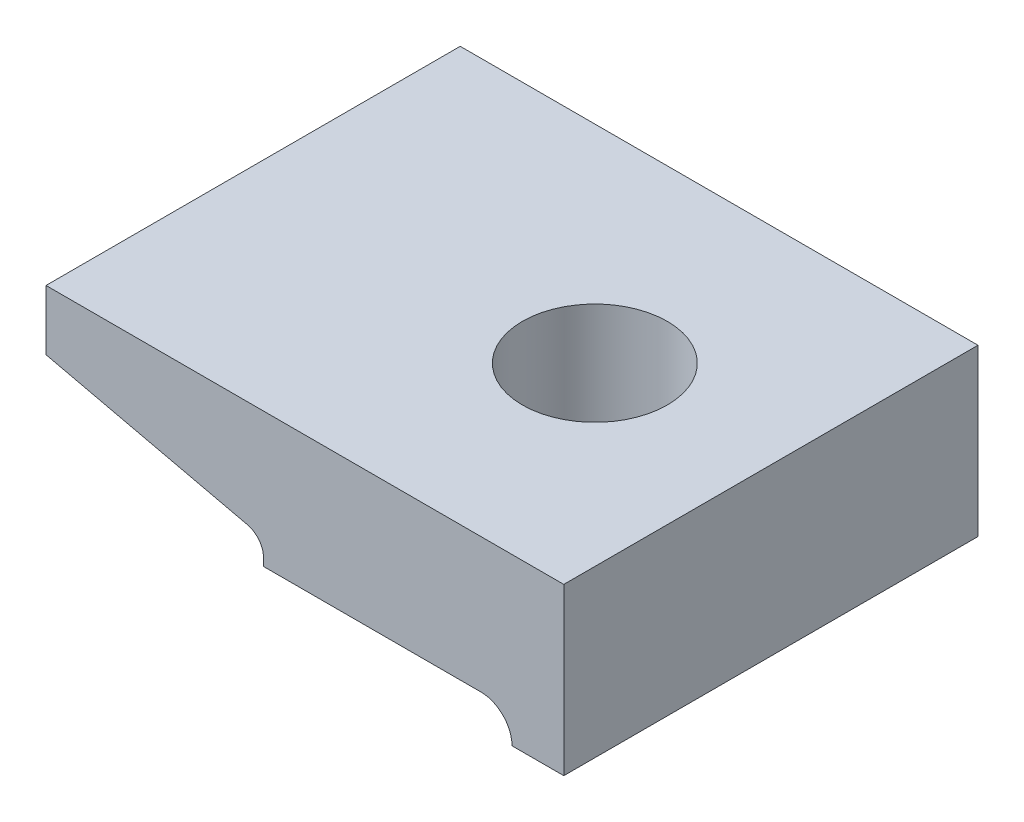
ISO-10303-21;
HEADER;
FILE_DESCRIPTION(('STEP AP214'),'2;1');
FILE_NAME('part.step','',(''),(''),'','','');
FILE_SCHEMA(('AUTOMOTIVE_DESIGN { 1 0 10303 214 1 1 1 1 }'));
ENDSEC;
DATA;
#1=APPLICATION_CONTEXT('core data for automotive mechanical design processes');
#2=APPLICATION_PROTOCOL_DEFINITION('international standard','automotive_design',2000,#1);
#3=PRODUCT_CONTEXT('',#1,'mechanical');
#4=PRODUCT('Part','Part','',(#3));
#5=PRODUCT_RELATED_PRODUCT_CATEGORY('part','',(#4));
#6=PRODUCT_DEFINITION_FORMATION('','',#4);
#7=PRODUCT_DEFINITION_CONTEXT('part definition',#1,'design');
#8=PRODUCT_DEFINITION('design','',#6,#7);
#9=PRODUCT_DEFINITION_SHAPE('','',#8);
#10=(LENGTH_UNIT() NAMED_UNIT(*) SI_UNIT(.MILLI.,.METRE.));
#11=(NAMED_UNIT(*) PLANE_ANGLE_UNIT() SI_UNIT($,.RADIAN.));
#12=(NAMED_UNIT(*) SI_UNIT($,.STERADIAN.) SOLID_ANGLE_UNIT());
#13=UNCERTAINTY_MEASURE_WITH_UNIT(LENGTH_MEASURE(1.E-05),#10,'distance_accuracy_value','');
#14=(GEOMETRIC_REPRESENTATION_CONTEXT(3) GLOBAL_UNCERTAINTY_ASSIGNED_CONTEXT((#13)) GLOBAL_UNIT_ASSIGNED_CONTEXT((#10,
#11,#12)) REPRESENTATION_CONTEXT('',''));
#15=CARTESIAN_POINT('',(0.,0.,0.));
#16=DIRECTION('',(0.,0.,1.));
#17=DIRECTION('',(1.,0.,0.));
#18=AXIS2_PLACEMENT_3D('',#15,#16,#17);
#19=CARTESIAN_POINT('',(70.,0.,20.));
#20=DIRECTION('',(0.,0.,-1.));
#21=DIRECTION('',(-1.,0.,0.));
#22=AXIS2_PLACEMENT_3D('',#19,#20,#21);
#23=CYLINDRICAL_SURFACE('',#22,3.);
#24=CARTESIAN_POINT('',(70.,0.,-20.));
#25=DIRECTION('',(0.,0.,-1.));
#26=DIRECTION('',(1.,0.,0.));
#27=AXIS2_PLACEMENT_3D('',#24,#25,#26);
#28=CIRCLE('',#27,3.);
#29=CARTESIAN_POINT('',(70.,3.,-20.));
#30=VERTEX_POINT('',#29);
#31=CARTESIAN_POINT('',(73.,0.,-20.));
#32=VERTEX_POINT('',#31);
#33=EDGE_CURVE('E140',#30,#32,#28,.T.);
#34=ORIENTED_EDGE('',*,*,#33,.T.);
#35=DIRECTION('',(0.,0.,-1.));
#36=VECTOR('',#35,1.);
#37=CARTESIAN_POINT('',(73.,0.,20.));
#38=LINE('',#37,#36);
#39=CARTESIAN_POINT('',(73.,0.,20.));
#40=VERTEX_POINT('',#39);
#41=EDGE_CURVE('E11',#40,#32,#38,.T.);
#42=ORIENTED_EDGE('',*,*,#41,.F.);
#43=CARTESIAN_POINT('',(70.,0.,20.));
#44=DIRECTION('',(0.,0.,-1.));
#45=DIRECTION('',(1.,0.,0.));
#46=AXIS2_PLACEMENT_3D('',#43,#44,#45);
#47=CIRCLE('',#46,3.);
#48=CARTESIAN_POINT('',(70.,3.,20.));
#49=VERTEX_POINT('',#48);
#50=EDGE_CURVE('E156',#49,#40,#47,.T.);
#51=ORIENTED_EDGE('',*,*,#50,.F.);
#52=DIRECTION('',(0.,0.,-1.));
#53=VECTOR('',#52,1.);
#54=CARTESIAN_POINT('',(70.,3.,20.));
#55=LINE('',#54,#53);
#56=EDGE_CURVE('E136',#49,#30,#55,.T.);
#57=ORIENTED_EDGE('',*,*,#56,.T.);
#58=EDGE_LOOP('',(#34,#42,#51,#57));
#59=FACE_BOUND('',#58,.T.);
#60=ADVANCED_FACE('F37',(#59),#23,.F.);
#61=CARTESIAN_POINT('',(73.,0.,20.));
#62=DIRECTION('',(0.,1.,0.));
#63=DIRECTION('',(0.,0.,1.));
#64=AXIS2_PLACEMENT_3D('',#61,#62,#63);
#65=PLANE('',#64);
#66=DIRECTION('',(1.,0.,0.));
#67=VECTOR('',#66,1.);
#68=CARTESIAN_POINT('',(73.,0.,-20.));
#69=LINE('',#68,#67);
#70=CARTESIAN_POINT('',(78.,0.,-20.));
#71=VERTEX_POINT('',#70);
#72=EDGE_CURVE('E143',#32,#71,#69,.T.);
#73=ORIENTED_EDGE('',*,*,#72,.T.);
#74=DIRECTION('',(0.,0.,-1.));
#75=VECTOR('',#74,1.);
#76=CARTESIAN_POINT('',(78.,0.,20.));
#77=LINE('',#76,#75);
#78=CARTESIAN_POINT('',(78.,0.,20.));
#79=VERTEX_POINT('',#78);
#80=EDGE_CURVE('E46',#79,#71,#77,.T.);
#81=ORIENTED_EDGE('',*,*,#80,.F.);
#82=DIRECTION('',(1.,0.,0.));
#83=VECTOR('',#82,1.);
#84=CARTESIAN_POINT('',(73.,0.,20.));
#85=LINE('',#84,#83);
#86=EDGE_CURVE('E100',#40,#79,#85,.T.);
#87=ORIENTED_EDGE('',*,*,#86,.F.);
#88=ORIENTED_EDGE('',*,*,#41,.T.);
#89=EDGE_LOOP('',(#73,#81,#87,#88));
#90=FACE_BOUND('',#89,.T.);
#91=ADVANCED_FACE('F216',(#90),#65,.F.);
#92=CARTESIAN_POINT('',(78.,0.,20.));
#93=DIRECTION('',(-1.,0.,0.));
#94=DIRECTION('',(0.,0.,1.));
#95=AXIS2_PLACEMENT_3D('',#92,#93,#94);
#96=PLANE('',#95);
#97=DIRECTION('',(0.,1.,0.));
#98=VECTOR('',#97,1.);
#99=CARTESIAN_POINT('',(78.,0.,-20.));
#100=LINE('',#99,#98);
#101=CARTESIAN_POINT('',(78.,16.,-20.));
#102=VERTEX_POINT('',#101);
#103=EDGE_CURVE('E145',#71,#102,#100,.T.);
#104=ORIENTED_EDGE('',*,*,#103,.T.);
#105=DIRECTION('',(0.,0.,-1.));
#106=VECTOR('',#105,1.);
#107=CARTESIAN_POINT('',(78.,16.,20.));
#108=LINE('',#107,#106);
#109=CARTESIAN_POINT('',(78.,16.,20.));
#110=VERTEX_POINT('',#109);
#111=EDGE_CURVE('E166',#110,#102,#108,.T.);
#112=ORIENTED_EDGE('',*,*,#111,.F.);
#113=DIRECTION('',(0.,1.,0.));
#114=VECTOR('',#113,1.);
#115=CARTESIAN_POINT('',(78.,0.,20.));
#116=LINE('',#115,#114);
#117=EDGE_CURVE('E175',#79,#110,#116,.T.);
#118=ORIENTED_EDGE('',*,*,#117,.F.);
#119=ORIENTED_EDGE('',*,*,#80,.T.);
#120=EDGE_LOOP('',(#104,#112,#118,#119));
#121=FACE_BOUND('',#120,.T.);
#122=ADVANCED_FACE('F173',(#121),#96,.F.);
#123=CARTESIAN_POINT('',(78.,16.,20.));
#124=DIRECTION('',(0.,-1.,0.));
#125=DIRECTION('',(1.,0.,0.));
#126=AXIS2_PLACEMENT_3D('',#123,#124,#125);
#127=PLANE('',#126);
#128=CARTESIAN_POINT('',(61.,16.,0.));
#129=DIRECTION('',(0.,1.,0.));
#130=DIRECTION('',(-1.,0.,0.));
#131=AXIS2_PLACEMENT_3D('',#128,#129,#130);
#132=CIRCLE('',#131,6.99999999999999);
#133=CARTESIAN_POINT('',(54.,16.,0.));
#134=VERTEX_POINT('',#133);
#135=EDGE_CURVE('E198',#134,#134,#132,.T.);
#136=ORIENTED_EDGE('',*,*,#135,.F.);
#137=EDGE_LOOP('',(#136));
#138=FACE_BOUND('',#137,.T.);
#139=DIRECTION('',(-1.,0.,0.));
#140=VECTOR('',#139,1.);
#141=CARTESIAN_POINT('',(78.,16.,-20.));
#142=LINE('',#141,#140);
#143=CARTESIAN_POINT('',(28.,16.,-20.));
#144=VERTEX_POINT('',#143);
#145=EDGE_CURVE('E147',#102,#144,#142,.T.);
#146=ORIENTED_EDGE('',*,*,#145,.T.);
#147=DIRECTION('',(0.,0.,-1.));
#148=VECTOR('',#147,1.);
#149=CARTESIAN_POINT('',(28.,16.,20.));
#150=LINE('',#149,#148);
#151=CARTESIAN_POINT('',(28.,16.,20.));
#152=VERTEX_POINT('',#151);
#153=EDGE_CURVE('E163',#152,#144,#150,.T.);
#154=ORIENTED_EDGE('',*,*,#153,.F.);
#155=DIRECTION('',(-1.,0.,0.));
#156=VECTOR('',#155,1.);
#157=CARTESIAN_POINT('',(78.,16.,20.));
#158=LINE('',#157,#156);
#159=EDGE_CURVE('E191',#110,#152,#158,.T.);
#160=ORIENTED_EDGE('',*,*,#159,.F.);
#161=ORIENTED_EDGE('',*,*,#111,.T.);
#162=EDGE_LOOP('',(#146,#154,#160,#161));
#163=FACE_BOUND('',#162,.T.);
#164=ADVANCED_FACE('F184',(#138,#163),#127,.F.);
#165=CARTESIAN_POINT('',(28.,16.,20.));
#166=DIRECTION('',(1.,0.,0.));
#167=DIRECTION('',(0.,0.,-1.));
#168=AXIS2_PLACEMENT_3D('',#165,#166,#167);
#169=PLANE('',#168);
#170=DIRECTION('',(0.,-1.,0.));
#171=VECTOR('',#170,1.);
#172=CARTESIAN_POINT('',(28.,16.,-20.));
#173=LINE('',#172,#171);
#174=CARTESIAN_POINT('',(28.,10.2057320136367,-20.));
#175=VERTEX_POINT('',#174);
#176=EDGE_CURVE('E149',#144,#175,#173,.T.);
#177=ORIENTED_EDGE('',*,*,#176,.T.);
#178=DIRECTION('',(0.,0.,-1.));
#179=VECTOR('',#178,1.);
#180=CARTESIAN_POINT('',(28.,10.2057320136367,20.));
#181=LINE('',#180,#179);
#182=CARTESIAN_POINT('',(28.,10.2057320136367,20.));
#183=VERTEX_POINT('',#182);
#184=EDGE_CURVE('E160',#183,#175,#181,.T.);
#185=ORIENTED_EDGE('',*,*,#184,.F.);
#186=DIRECTION('',(0.,-1.,0.));
#187=VECTOR('',#186,1.);
#188=CARTESIAN_POINT('',(28.,16.,20.));
#189=LINE('',#188,#187);
#190=EDGE_CURVE('E190',#152,#183,#189,.T.);
#191=ORIENTED_EDGE('',*,*,#190,.F.);
#192=ORIENTED_EDGE('',*,*,#153,.T.);
#193=EDGE_LOOP('',(#177,#185,#191,#192));
#194=FACE_BOUND('',#193,.T.);
#195=ADVANCED_FACE('F188',(#194),#169,.F.);
#196=CARTESIAN_POINT('',(28.,10.2057320136367,20.));
#197=DIRECTION('',(0.224951054343858,0.974370064785237,0.));
#198=DIRECTION('',(-0.974370064785237,0.224951054343858,0.));
#199=AXIS2_PLACEMENT_3D('',#196,#197,#198);
#200=PLANE('',#199);
#201=DIRECTION('',(0.974370064785237,-0.224951054343858,0.));
#202=VECTOR('',#201,1.);
#203=CARTESIAN_POINT('',(28.,10.2057320136367,-20.));
#204=LINE('',#203,#202);
#205=CARTESIAN_POINT('',(47.4499021086877,5.71536829623481,-20.));
#206=VERTEX_POINT('',#205);
#207=EDGE_CURVE('E151',#175,#206,#204,.T.);
#208=ORIENTED_EDGE('',*,*,#207,.T.);
#209=DIRECTION('',(0.,0.,-1.));
#210=VECTOR('',#209,1.);
#211=CARTESIAN_POINT('',(47.4499021086877,5.71536829623481,20.));
#212=LINE('',#211,#210);
#213=CARTESIAN_POINT('',(47.4499021086877,5.71536829623481,20.));
#214=VERTEX_POINT('',#213);
#215=EDGE_CURVE('E131',#214,#206,#212,.T.);
#216=ORIENTED_EDGE('',*,*,#215,.F.);
#217=DIRECTION('',(0.974370064785237,-0.224951054343858,0.));
#218=VECTOR('',#217,1.);
#219=CARTESIAN_POINT('',(28.,10.2057320136367,20.));
#220=LINE('',#219,#218);
#221=EDGE_CURVE('E122',#183,#214,#220,.T.);
#222=ORIENTED_EDGE('',*,*,#221,.F.);
#223=ORIENTED_EDGE('',*,*,#184,.T.);
#224=EDGE_LOOP('',(#208,#216,#222,#223));
#225=FACE_BOUND('',#224,.T.);
#226=ADVANCED_FACE('F224',(#225),#200,.F.);
#227=CARTESIAN_POINT('',(47.,3.76662816666433,20.));
#228=DIRECTION('',(0.,0.,-1.));
#229=DIRECTION('',(-1.,0.,0.));
#230=AXIS2_PLACEMENT_3D('',#227,#228,#229);
#231=CYLINDRICAL_SURFACE('',#230,2.);
#232=CARTESIAN_POINT('',(47.,3.76662816666433,-20.));
#233=DIRECTION('',(0.,0.,-1.));
#234=DIRECTION('',(-1.,0.,0.));
#235=AXIS2_PLACEMENT_3D('',#232,#233,#234);
#236=CIRCLE('',#235,2.);
#237=CARTESIAN_POINT('',(49.,3.76662816666433,-20.));
#238=VERTEX_POINT('',#237);
#239=EDGE_CURVE('E130',#206,#238,#236,.T.);
#240=ORIENTED_EDGE('',*,*,#239,.T.);
#241=DIRECTION('',(0.,0.,-1.));
#242=VECTOR('',#241,1.);
#243=CARTESIAN_POINT('',(49.,3.76662816666433,20.));
#244=LINE('',#243,#242);
#245=CARTESIAN_POINT('',(49.,3.76662816666433,20.));
#246=VERTEX_POINT('',#245);
#247=EDGE_CURVE('E127',#246,#238,#244,.T.);
#248=ORIENTED_EDGE('',*,*,#247,.F.);
#249=CARTESIAN_POINT('',(47.,3.76662816666433,20.));
#250=DIRECTION('',(0.,0.,-1.));
#251=DIRECTION('',(-1.,0.,0.));
#252=AXIS2_PLACEMENT_3D('',#249,#250,#251);
#253=CIRCLE('',#252,2.);
#254=EDGE_CURVE('E116',#214,#246,#253,.T.);
#255=ORIENTED_EDGE('',*,*,#254,.F.);
#256=ORIENTED_EDGE('',*,*,#215,.T.);
#257=EDGE_LOOP('',(#240,#248,#255,#256));
#258=FACE_BOUND('',#257,.T.);
#259=ADVANCED_FACE('F128',(#258),#231,.F.);
#260=CARTESIAN_POINT('',(49.,3.76662816666433,20.));
#261=DIRECTION('',(1.,0.,0.));
#262=DIRECTION('',(0.,0.,-1.));
#263=AXIS2_PLACEMENT_3D('',#260,#261,#262);
#264=PLANE('',#263);
#265=DIRECTION('',(0.,-1.,0.));
#266=VECTOR('',#265,1.);
#267=CARTESIAN_POINT('',(49.,3.76662816666433,-20.));
#268=LINE('',#267,#266);
#269=CARTESIAN_POINT('',(49.,3.,-20.));
#270=VERTEX_POINT('',#269);
#271=EDGE_CURVE('E86',#238,#270,#268,.T.);
#272=ORIENTED_EDGE('',*,*,#271,.T.);
#273=DIRECTION('',(0.,0.,-1.));
#274=VECTOR('',#273,1.);
#275=CARTESIAN_POINT('',(49.,3.,20.));
#276=LINE('',#275,#274);
#277=CARTESIAN_POINT('',(49.,3.,20.));
#278=VERTEX_POINT('',#277);
#279=EDGE_CURVE('E132',#278,#270,#276,.T.);
#280=ORIENTED_EDGE('',*,*,#279,.F.);
#281=DIRECTION('',(0.,-1.,0.));
#282=VECTOR('',#281,1.);
#283=CARTESIAN_POINT('',(49.,3.76662816666433,20.));
#284=LINE('',#283,#282);
#285=EDGE_CURVE('E120',#246,#278,#284,.T.);
#286=ORIENTED_EDGE('',*,*,#285,.F.);
#287=ORIENTED_EDGE('',*,*,#247,.T.);
#288=EDGE_LOOP('',(#272,#280,#286,#287));
#289=FACE_BOUND('',#288,.T.);
#290=ADVANCED_FACE('F134',(#289),#264,.F.);
#291=CARTESIAN_POINT('',(49.,3.,20.));
#292=DIRECTION('',(0.,1.,0.));
#293=DIRECTION('',(0.,0.,1.));
#294=AXIS2_PLACEMENT_3D('',#291,#292,#293);
#295=PLANE('',#294);
#296=CARTESIAN_POINT('',(61.,3.,0.));
#297=DIRECTION('',(0.,1.,0.));
#298=DIRECTION('',(0.,0.,1.));
#299=AXIS2_PLACEMENT_3D('',#296,#297,#298);
#300=CIRCLE('',#299,6.99999999999999);
#301=CARTESIAN_POINT('',(61.,3.,6.99999999999999));
#302=VERTEX_POINT('',#301);
#303=EDGE_CURVE('E40',#302,#302,#300,.T.);
#304=ORIENTED_EDGE('',*,*,#303,.T.);
#305=EDGE_LOOP('',(#304));
#306=FACE_BOUND('',#305,.T.);
#307=DIRECTION('',(1.,0.,0.));
#308=VECTOR('',#307,1.);
#309=CARTESIAN_POINT('',(49.,3.,-20.));
#310=LINE('',#309,#308);
#311=EDGE_CURVE('E92',#270,#30,#310,.T.);
#312=ORIENTED_EDGE('',*,*,#311,.T.);
#313=ORIENTED_EDGE('',*,*,#56,.F.);
#314=DIRECTION('',(1.,0.,0.));
#315=VECTOR('',#314,1.);
#316=CARTESIAN_POINT('',(49.,3.,20.));
#317=LINE('',#316,#315);
#318=EDGE_CURVE('E54',#278,#49,#317,.T.);
#319=ORIENTED_EDGE('',*,*,#318,.F.);
#320=ORIENTED_EDGE('',*,*,#279,.T.);
#321=EDGE_LOOP('',(#312,#313,#319,#320));
#322=FACE_BOUND('',#321,.T.);
#323=ADVANCED_FACE('F205',(#306,#322),#295,.F.);
#324=CARTESIAN_POINT('',(70.,0.,20.));
#325=DIRECTION('',(0.,0.,1.));
#326=DIRECTION('',(1.,0.,0.));
#327=AXIS2_PLACEMENT_3D('',#324,#325,#326);
#328=PLANE('',#327);
#329=ORIENTED_EDGE('',*,*,#50,.T.);
#330=ORIENTED_EDGE('',*,*,#86,.T.);
#331=ORIENTED_EDGE('',*,*,#117,.T.);
#332=ORIENTED_EDGE('',*,*,#159,.T.);
#333=ORIENTED_EDGE('',*,*,#190,.T.);
#334=ORIENTED_EDGE('',*,*,#221,.T.);
#335=ORIENTED_EDGE('',*,*,#254,.T.);
#336=ORIENTED_EDGE('',*,*,#285,.T.);
#337=ORIENTED_EDGE('',*,*,#318,.T.);
#338=EDGE_LOOP('',(#329,#330,#331,#332,#333,#334,#335,#336,#337));
#339=FACE_BOUND('',#338,.T.);
#340=ADVANCED_FACE('F118',(#339),#328,.T.);
#341=CARTESIAN_POINT('',(70.,0.,-20.));
#342=DIRECTION('',(0.,0.,1.));
#343=DIRECTION('',(1.,0.,0.));
#344=AXIS2_PLACEMENT_3D('',#341,#342,#343);
#345=PLANE('',#344);
#346=ORIENTED_EDGE('',*,*,#33,.F.);
#347=ORIENTED_EDGE('',*,*,#311,.F.);
#348=ORIENTED_EDGE('',*,*,#271,.F.);
#349=ORIENTED_EDGE('',*,*,#239,.F.);
#350=ORIENTED_EDGE('',*,*,#207,.F.);
#351=ORIENTED_EDGE('',*,*,#176,.F.);
#352=ORIENTED_EDGE('',*,*,#145,.F.);
#353=ORIENTED_EDGE('',*,*,#103,.F.);
#354=ORIENTED_EDGE('',*,*,#72,.F.);
#355=EDGE_LOOP('',(#346,#347,#348,#349,#350,#351,#352,#353,#354));
#356=FACE_BOUND('',#355,.T.);
#357=ADVANCED_FACE('F179',(#356),#345,.F.);
#358=CARTESIAN_POINT('',(61.,0.,0.));
#359=DIRECTION('',(0.,1.,0.));
#360=DIRECTION('',(-1.,0.,0.));
#361=AXIS2_PLACEMENT_3D('',#358,#359,#360);
#362=CYLINDRICAL_SURFACE('',#361,6.99999999999999);
#363=ORIENTED_EDGE('',*,*,#135,.T.);
#364=EDGE_LOOP('',(#363));
#365=FACE_BOUND('',#364,.T.);
#366=ORIENTED_EDGE('',*,*,#303,.F.);
#367=EDGE_LOOP('',(#366));
#368=FACE_BOUND('',#367,.T.);
#369=ADVANCED_FACE('F207',(#365,#368),#362,.F.);
#370=CLOSED_SHELL('',(#60,#91,#122,#164,#195,#226,#259,#290,#323,#340,#357,#369));
#371=MANIFOLD_SOLID_BREP('B2',#370);
#372=ADVANCED_BREP_SHAPE_REPRESENTATION('',(#18,#371),#14);
#373=SHAPE_DEFINITION_REPRESENTATION(#9,#372);
ENDSEC;
END-ISO-10303-21;
